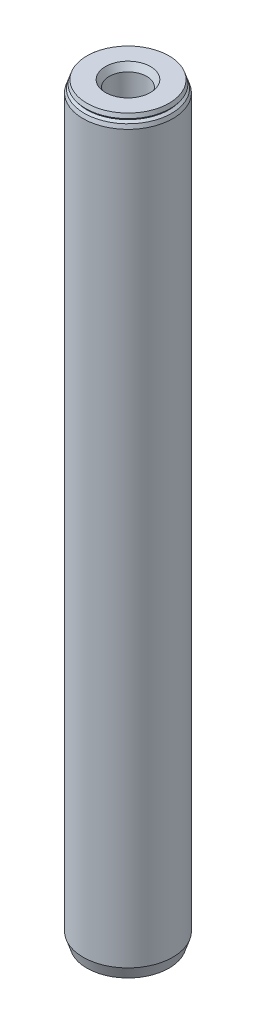
ISO-10303-21;
HEADER;
FILE_DESCRIPTION(('STEP AP214'),'2;1');
FILE_NAME('part.step','',(''),(''),'','','');
FILE_SCHEMA(('AUTOMOTIVE_DESIGN { 1 0 10303 214 1 1 1 1 }'));
ENDSEC;
DATA;
#1=APPLICATION_CONTEXT('core data for automotive mechanical design processes');
#2=APPLICATION_PROTOCOL_DEFINITION('international standard','automotive_design',2000,#1);
#3=PRODUCT_CONTEXT('',#1,'mechanical');
#4=PRODUCT('Part','Part','',(#3));
#5=PRODUCT_RELATED_PRODUCT_CATEGORY('part','',(#4));
#6=PRODUCT_DEFINITION_FORMATION('','',#4);
#7=PRODUCT_DEFINITION_CONTEXT('part definition',#1,'design');
#8=PRODUCT_DEFINITION('design','',#6,#7);
#9=PRODUCT_DEFINITION_SHAPE('','',#8);
#10=(LENGTH_UNIT() NAMED_UNIT(*) SI_UNIT(.MILLI.,.METRE.));
#11=(NAMED_UNIT(*) PLANE_ANGLE_UNIT() SI_UNIT($,.RADIAN.));
#12=(NAMED_UNIT(*) SI_UNIT($,.STERADIAN.) SOLID_ANGLE_UNIT());
#13=UNCERTAINTY_MEASURE_WITH_UNIT(LENGTH_MEASURE(1.E-05),#10,'distance_accuracy_value','');
#14=(GEOMETRIC_REPRESENTATION_CONTEXT(3) GLOBAL_UNCERTAINTY_ASSIGNED_CONTEXT((#13)) GLOBAL_UNIT_ASSIGNED_CONTEXT((#10,
#11,#12)) REPRESENTATION_CONTEXT('',''));
#15=CARTESIAN_POINT('',(0.,0.,0.));
#16=DIRECTION('',(0.,0.,1.));
#17=DIRECTION('',(1.,0.,0.));
#18=AXIS2_PLACEMENT_3D('',#15,#16,#17);
#19=CARTESIAN_POINT('',(0.,50.0126,0.));
#20=DIRECTION('',(0.,-1.,0.));
#21=DIRECTION('',(0.,0.,-1.));
#22=AXIS2_PLACEMENT_3D('',#19,#20,#21);
#23=PLANE('',#22);
#24=CARTESIAN_POINT('',(0.,50.0126,0.));
#25=DIRECTION('',(0.,-1.,0.));
#26=DIRECTION('',(0.,0.,-1.));
#27=AXIS2_PLACEMENT_3D('',#24,#25,#26);
#28=CIRCLE('',#27,1.50399999999999);
#29=CARTESIAN_POINT('',(0.,50.0126,-1.50399999999999));
#30=VERTEX_POINT('',#29);
#31=EDGE_CURVE('E11',#30,#30,#28,.T.);
#32=ORIENTED_EDGE('',*,*,#31,.T.);
#33=EDGE_LOOP('',(#32));
#34=FACE_BOUND('',#33,.T.);
#35=CARTESIAN_POINT('',(0.,50.0126,0.));
#36=DIRECTION('',(0.,1.,0.));
#37=DIRECTION('',(0.,0.,1.));
#38=AXIS2_PLACEMENT_3D('',#35,#36,#37);
#39=CIRCLE('',#38,2.74319999999998);
#40=CARTESIAN_POINT('',(0.,50.0126,2.74319999999998));
#41=VERTEX_POINT('',#40);
#42=EDGE_CURVE('E63',#41,#41,#39,.T.);
#43=ORIENTED_EDGE('',*,*,#42,.T.);
#44=EDGE_LOOP('',(#43));
#45=FACE_BOUND('',#44,.T.);
#46=ADVANCED_FACE('F16',(#34,#45),#23,.F.);
#47=CARTESIAN_POINT('',(0.,49.7520827788524,0.));
#48=DIRECTION('',(0.,-1.,0.));
#49=DIRECTION('',(0.,0.,-1.));
#50=AXIS2_PLACEMENT_3D('',#47,#48,#49);
#51=CONICAL_SURFACE('',#50,2.83003907371584,0.321750554396634);
#52=ORIENTED_EDGE('',*,*,#42,.F.);
#53=EDGE_LOOP('',(#52));
#54=FACE_BOUND('',#53,.T.);
#55=CARTESIAN_POINT('',(0.,49.7520827788524,0.));
#56=DIRECTION('',(0.,1.,0.));
#57=DIRECTION('',(0.,0.,1.));
#58=AXIS2_PLACEMENT_3D('',#55,#56,#57);
#59=CIRCLE('',#58,2.83003907371584);
#60=CARTESIAN_POINT('',(0.,49.7520827788524,2.83003907371584));
#61=VERTEX_POINT('',#60);
#62=EDGE_CURVE('E60',#61,#61,#59,.T.);
#63=ORIENTED_EDGE('',*,*,#62,.T.);
#64=EDGE_LOOP('',(#63));
#65=FACE_BOUND('',#64,.T.);
#66=ADVANCED_FACE('F84',(#54,#65),#51,.T.);
#67=CARTESIAN_POINT('',(0.,49.6316,0.));
#68=DIRECTION('',(0.,1.,0.));
#69=DIRECTION('',(0.,0.,1.));
#70=AXIS2_PLACEMENT_3D('',#67,#68,#69);
#71=CONICAL_SURFACE('',#70,2.74319999999998,0.624522886199129);
#72=ORIENTED_EDGE('',*,*,#62,.F.);
#73=EDGE_LOOP('',(#72));
#74=FACE_BOUND('',#73,.T.);
#75=CARTESIAN_POINT('',(0.,49.6316,0.));
#76=DIRECTION('',(0.,1.,0.));
#77=DIRECTION('',(0.,0.,1.));
#78=AXIS2_PLACEMENT_3D('',#75,#76,#77);
#79=CIRCLE('',#78,2.74319999999998);
#80=CARTESIAN_POINT('',(0.,49.6316,2.74319999999998));
#81=VERTEX_POINT('',#80);
#82=EDGE_CURVE('E57',#81,#81,#79,.T.);
#83=ORIENTED_EDGE('',*,*,#82,.T.);
#84=EDGE_LOOP('',(#83));
#85=FACE_BOUND('',#84,.T.);
#86=ADVANCED_FACE('F90',(#74,#85),#71,.T.);
#87=CARTESIAN_POINT('',(0.,49.5111172211476,0.));
#88=DIRECTION('',(0.,-1.,0.));
#89=DIRECTION('',(0.,0.,-1.));
#90=AXIS2_PLACEMENT_3D('',#87,#88,#89);
#91=CONICAL_SURFACE('',#90,2.91036092628412,0.946273440595771);
#92=ORIENTED_EDGE('',*,*,#82,.F.);
#93=EDGE_LOOP('',(#92));
#94=FACE_BOUND('',#93,.T.);
#95=CARTESIAN_POINT('',(0.,49.5111172211476,0.));
#96=DIRECTION('',(0.,1.,0.));
#97=DIRECTION('',(0.,0.,1.));
#98=AXIS2_PLACEMENT_3D('',#95,#96,#97);
#99=CIRCLE('',#98,2.91036092628412);
#100=CARTESIAN_POINT('',(0.,49.5111172211476,2.91036092628412));
#101=VERTEX_POINT('',#100);
#102=EDGE_CURVE('E54',#101,#101,#99,.T.);
#103=ORIENTED_EDGE('',*,*,#102,.T.);
#104=EDGE_LOOP('',(#103));
#105=FACE_BOUND('',#104,.T.);
#106=ADVANCED_FACE('F97',(#94,#105),#91,.T.);
#107=CARTESIAN_POINT('',(0.,49.2506,0.));
#108=DIRECTION('',(0.,-1.,0.));
#109=DIRECTION('',(0.,0.,-1.));
#110=AXIS2_PLACEMENT_3D('',#107,#108,#109);
#111=CONICAL_SURFACE('',#110,2.99719999999998,0.321750554396655);
#112=ORIENTED_EDGE('',*,*,#102,.F.);
#113=EDGE_LOOP('',(#112));
#114=FACE_BOUND('',#113,.T.);
#115=CARTESIAN_POINT('',(0.,49.2506,0.));
#116=DIRECTION('',(0.,1.,0.));
#117=DIRECTION('',(0.,0.,1.));
#118=AXIS2_PLACEMENT_3D('',#115,#116,#117);
#119=CIRCLE('',#118,2.99719999999998);
#120=CARTESIAN_POINT('',(0.,49.2506,2.99719999999998));
#121=VERTEX_POINT('',#120);
#122=EDGE_CURVE('E51',#121,#121,#119,.T.);
#123=ORIENTED_EDGE('',*,*,#122,.T.);
#124=EDGE_LOOP('',(#123));
#125=FACE_BOUND('',#124,.T.);
#126=ADVANCED_FACE('F101',(#114,#125),#111,.T.);
#127=CARTESIAN_POINT('',(0.,50.0126,0.));
#128=DIRECTION('',(0.,1.,0.));
#129=DIRECTION('',(0.,0.,1.));
#130=AXIS2_PLACEMENT_3D('',#127,#128,#129);
#131=CYLINDRICAL_SURFACE('',#130,2.99719999999998);
#132=ORIENTED_EDGE('',*,*,#122,.F.);
#133=EDGE_LOOP('',(#132));
#134=FACE_BOUND('',#133,.T.);
#135=CARTESIAN_POINT('',(0.,0.761999999999999,0.));
#136=DIRECTION('',(0.,1.,0.));
#137=DIRECTION('',(0.,0.,1.));
#138=AXIS2_PLACEMENT_3D('',#135,#136,#137);
#139=CIRCLE('',#138,2.99719999999998);
#140=CARTESIAN_POINT('',(0.,0.761999999999999,2.99719999999998));
#141=VERTEX_POINT('',#140);
#142=EDGE_CURVE('E48',#141,#141,#139,.T.);
#143=ORIENTED_EDGE('',*,*,#142,.T.);
#144=EDGE_LOOP('',(#143));
#145=FACE_BOUND('',#144,.T.);
#146=ADVANCED_FACE('F105',(#134,#145),#131,.T.);
#147=CARTESIAN_POINT('',(0.,0.,0.));
#148=DIRECTION('',(0.,1.,0.));
#149=DIRECTION('',(0.,0.,1.));
#150=AXIS2_PLACEMENT_3D('',#147,#148,#149);
#151=CONICAL_SURFACE('',#150,2.74319999999998,0.321750554396644);
#152=ORIENTED_EDGE('',*,*,#142,.F.);
#153=EDGE_LOOP('',(#152));
#154=FACE_BOUND('',#153,.T.);
#155=CARTESIAN_POINT('',(0.,0.,0.));
#156=DIRECTION('',(0.,1.,0.));
#157=DIRECTION('',(0.,0.,1.));
#158=AXIS2_PLACEMENT_3D('',#155,#156,#157);
#159=CIRCLE('',#158,2.74319999999998);
#160=CARTESIAN_POINT('',(0.,0.,2.74319999999998));
#161=VERTEX_POINT('',#160);
#162=EDGE_CURVE('E43',#161,#161,#159,.T.);
#163=ORIENTED_EDGE('',*,*,#162,.T.);
#164=EDGE_LOOP('',(#163));
#165=FACE_BOUND('',#164,.T.);
#166=ADVANCED_FACE('F109',(#154,#165),#151,.T.);
#167=CARTESIAN_POINT('',(2.74319999999998,0.,0.));
#168=DIRECTION('',(0.,1.,0.));
#169=DIRECTION('',(0.,0.,1.));
#170=AXIS2_PLACEMENT_3D('',#167,#168,#169);
#171=PLANE('',#170);
#172=CARTESIAN_POINT('',(0.,0.,0.));
#173=DIRECTION('',(0.,1.,0.));
#174=DIRECTION('',(0.,0.,1.));
#175=AXIS2_PLACEMENT_3D('',#172,#173,#174);
#176=CIRCLE('',#175,1.50399999999999);
#177=CARTESIAN_POINT('',(0.,0.,1.50399999999999));
#178=VERTEX_POINT('',#177);
#179=EDGE_CURVE('E69',#178,#178,#176,.T.);
#180=ORIENTED_EDGE('',*,*,#179,.T.);
#181=EDGE_LOOP('',(#180));
#182=FACE_BOUND('',#181,.T.);
#183=ORIENTED_EDGE('',*,*,#162,.F.);
#184=EDGE_LOOP('',(#183));
#185=FACE_BOUND('',#184,.T.);
#186=ADVANCED_FACE('F113',(#182,#185),#171,.F.);
#187=CARTESIAN_POINT('',(0.,0.,0.));
#188=DIRECTION('',(0.,-1.,0.));
#189=DIRECTION('',(0.,0.,-1.));
#190=AXIS2_PLACEMENT_3D('',#187,#188,#189);
#191=CYLINDRICAL_SURFACE('',#190,1.25);
#192=CARTESIAN_POINT('',(0.,0.439940905122491,0.));
#193=DIRECTION('',(0.,1.,0.));
#194=DIRECTION('',(0.,0.,1.));
#195=AXIS2_PLACEMENT_3D('',#192,#193,#194);
#196=CIRCLE('',#195,1.25);
#197=CARTESIAN_POINT('',(0.,0.439940905122491,1.25));
#198=VERTEX_POINT('',#197);
#199=EDGE_CURVE('E66',#198,#198,#196,.F.);
#200=ORIENTED_EDGE('',*,*,#199,.T.);
#201=EDGE_LOOP('',(#200));
#202=FACE_BOUND('',#201,.T.);
#203=CARTESIAN_POINT('',(0.,5.08,0.));
#204=DIRECTION('',(0.,-1.,0.));
#205=DIRECTION('',(0.,0.,-1.));
#206=AXIS2_PLACEMENT_3D('',#203,#204,#205);
#207=CIRCLE('',#206,1.25);
#208=CARTESIAN_POINT('',(0.,5.08,-1.25));
#209=VERTEX_POINT('',#208);
#210=EDGE_CURVE('E40',#209,#209,#207,.T.);
#211=ORIENTED_EDGE('',*,*,#210,.F.);
#212=EDGE_LOOP('',(#211));
#213=FACE_BOUND('',#212,.T.);
#214=ADVANCED_FACE('F117',(#202,#213),#191,.F.);
#215=CARTESIAN_POINT('',(0.,5.08,0.));
#216=DIRECTION('',(0.,-1.,0.));
#217=DIRECTION('',(0.,0.,-1.));
#218=AXIS2_PLACEMENT_3D('',#215,#216,#217);
#219=CONICAL_SURFACE('',#218,1.25,1.02974425867665);
#220=CARTESIAN_POINT('',(0.,5.83107577378445,0.));
#221=VERTEX_POINT('',#220);
#222=VERTEX_LOOP('',#221);
#223=FACE_BOUND('',#222,.T.);
#224=ORIENTED_EDGE('',*,*,#210,.T.);
#225=EDGE_LOOP('',(#224));
#226=FACE_BOUND('',#225,.T.);
#227=ADVANCED_FACE('F121',(#223,#226),#219,.F.);
#228=CARTESIAN_POINT('',(0.,50.0126,0.));
#229=DIRECTION('',(0.,1.,0.));
#230=DIRECTION('',(0.,0.,1.));
#231=AXIS2_PLACEMENT_3D('',#228,#229,#230);
#232=CYLINDRICAL_SURFACE('',#231,1.25);
#233=CARTESIAN_POINT('',(0.,49.5726590948775,0.));
#234=DIRECTION('',(0.,-1.,0.));
#235=DIRECTION('',(0.,0.,-1.));
#236=AXIS2_PLACEMENT_3D('',#233,#234,#235);
#237=CIRCLE('',#236,1.25);
#238=CARTESIAN_POINT('',(0.,49.5726590948775,-1.25));
#239=VERTEX_POINT('',#238);
#240=EDGE_CURVE('E24',#239,#239,#237,.F.);
#241=ORIENTED_EDGE('',*,*,#240,.T.);
#242=EDGE_LOOP('',(#241));
#243=FACE_BOUND('',#242,.T.);
#244=CARTESIAN_POINT('',(0.,44.9326,0.));
#245=DIRECTION('',(0.,1.,0.));
#246=DIRECTION('',(0.,0.,1.));
#247=AXIS2_PLACEMENT_3D('',#244,#245,#246);
#248=CIRCLE('',#247,1.25);
#249=CARTESIAN_POINT('',(0.,44.9326,1.25));
#250=VERTEX_POINT('',#249);
#251=EDGE_CURVE('E38',#250,#250,#248,.T.);
#252=ORIENTED_EDGE('',*,*,#251,.F.);
#253=EDGE_LOOP('',(#252));
#254=FACE_BOUND('',#253,.T.);
#255=ADVANCED_FACE('F34',(#243,#254),#232,.F.);
#256=CARTESIAN_POINT('',(0.,44.9326,0.));
#257=DIRECTION('',(0.,1.,0.));
#258=DIRECTION('',(0.,0.,1.));
#259=AXIS2_PLACEMENT_3D('',#256,#257,#258);
#260=CONICAL_SURFACE('',#259,1.25,1.02974425867665);
#261=CARTESIAN_POINT('',(0.,44.1815242262155,0.));
#262=VERTEX_POINT('',#261);
#263=VERTEX_LOOP('',#262);
#264=FACE_BOUND('',#263,.T.);
#265=ORIENTED_EDGE('',*,*,#251,.T.);
#266=EDGE_LOOP('',(#265));
#267=FACE_BOUND('',#266,.T.);
#268=ADVANCED_FACE('F30',(#264,#267),#260,.F.);
#269=CARTESIAN_POINT('',(0.,0.439940905122491,0.));
#270=DIRECTION('',(0.,-1.,0.));
#271=DIRECTION('',(0.,0.,-1.));
#272=AXIS2_PLACEMENT_3D('',#269,#270,#271);
#273=CONICAL_SURFACE('',#272,1.25,0.523598775598296);
#274=ORIENTED_EDGE('',*,*,#179,.F.);
#275=EDGE_LOOP('',(#274));
#276=FACE_BOUND('',#275,.T.);
#277=ORIENTED_EDGE('',*,*,#199,.F.);
#278=EDGE_LOOP('',(#277));
#279=FACE_BOUND('',#278,.T.);
#280=ADVANCED_FACE('F33',(#276,#279),#273,.F.);
#281=CARTESIAN_POINT('',(0.,49.5726590948775,0.));
#282=DIRECTION('',(0.,1.,0.));
#283=DIRECTION('',(0.,0.,1.));
#284=AXIS2_PLACEMENT_3D('',#281,#282,#283);
#285=CONICAL_SURFACE('',#284,1.25,0.523598775598296);
#286=ORIENTED_EDGE('',*,*,#31,.F.);
#287=EDGE_LOOP('',(#286));
#288=FACE_BOUND('',#287,.T.);
#289=ORIENTED_EDGE('',*,*,#240,.F.);
#290=EDGE_LOOP('',(#289));
#291=FACE_BOUND('',#290,.T.);
#292=ADVANCED_FACE('F18',(#288,#291),#285,.F.);
#293=CLOSED_SHELL('',(#46,#66,#86,#106,#126,#146,#166,#186,#214,#227,#255,#268,#280,#292));
#294=MANIFOLD_SOLID_BREP('B1',#293);
#295=ADVANCED_BREP_SHAPE_REPRESENTATION('',(#18,#294),#14);
#296=SHAPE_DEFINITION_REPRESENTATION(#9,#295);
ENDSEC;
END-ISO-10303-21;
